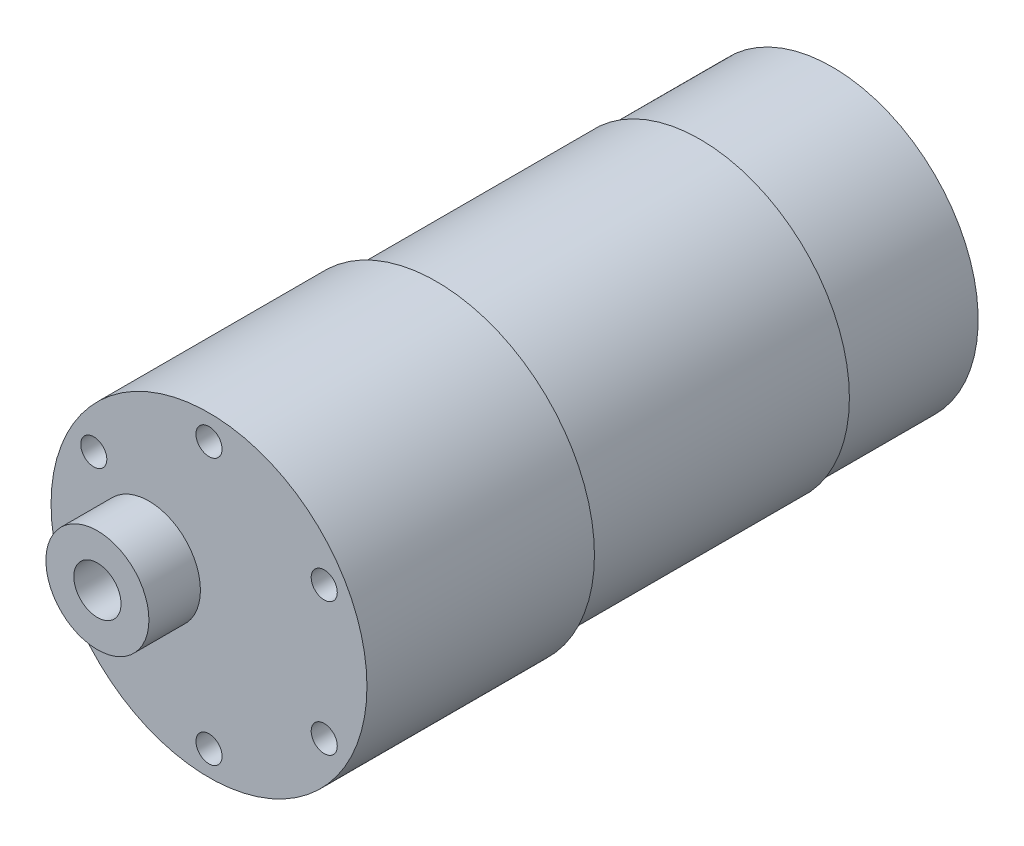
ISO-10303-21;
HEADER;
FILE_DESCRIPTION(('STEP AP214'),'2;1');
FILE_NAME('part.step','',(''),(''),'','','');
FILE_SCHEMA(('AUTOMOTIVE_DESIGN { 1 0 10303 214 1 1 1 1 }'));
ENDSEC;
DATA;
#1=APPLICATION_CONTEXT('core data for automotive mechanical design processes');
#2=APPLICATION_PROTOCOL_DEFINITION('international standard','automotive_design',2000,#1);
#3=PRODUCT_CONTEXT('',#1,'mechanical');
#4=PRODUCT('Part','Part','',(#3));
#5=PRODUCT_RELATED_PRODUCT_CATEGORY('part','',(#4));
#6=PRODUCT_DEFINITION_FORMATION('','',#4);
#7=PRODUCT_DEFINITION_CONTEXT('part definition',#1,'design');
#8=PRODUCT_DEFINITION('design','',#6,#7);
#9=PRODUCT_DEFINITION_SHAPE('','',#8);
#10=(LENGTH_UNIT() NAMED_UNIT(*) SI_UNIT(.MILLI.,.METRE.));
#11=(NAMED_UNIT(*) PLANE_ANGLE_UNIT() SI_UNIT($,.RADIAN.));
#12=(NAMED_UNIT(*) SI_UNIT($,.STERADIAN.) SOLID_ANGLE_UNIT());
#13=UNCERTAINTY_MEASURE_WITH_UNIT(LENGTH_MEASURE(1.E-05),#10,'distance_accuracy_value','');
#14=(GEOMETRIC_REPRESENTATION_CONTEXT(3) GLOBAL_UNCERTAINTY_ASSIGNED_CONTEXT((#13)) GLOBAL_UNIT_ASSIGNED_CONTEXT((#10,
#11,#12)) REPRESENTATION_CONTEXT('',''));
#15=CARTESIAN_POINT('',(0.,0.,0.));
#16=DIRECTION('',(0.,0.,1.));
#17=DIRECTION('',(1.,0.,0.));
#18=AXIS2_PLACEMENT_3D('',#15,#16,#17);
#19=CARTESIAN_POINT('',(7.,0.,-26.5));
#20=DIRECTION('',(0.,0.,-1.));
#21=DIRECTION('',(-1.,0.,0.));
#22=AXIS2_PLACEMENT_3D('',#19,#20,#21);
#23=CYLINDRICAL_SURFACE('',#22,17.4);
#24=CARTESIAN_POINT('',(7.,0.,-26.5));
#25=DIRECTION('',(0.,0.,1.));
#26=DIRECTION('',(1.,0.,0.));
#27=AXIS2_PLACEMENT_3D('',#24,#25,#26);
#28=CIRCLE('',#27,17.4);
#29=CARTESIAN_POINT('',(24.4,0.,-26.5));
#30=VERTEX_POINT('',#29);
#31=EDGE_CURVE('E42',#30,#30,#28,.T.);
#32=ORIENTED_EDGE('',*,*,#31,.F.);
#33=EDGE_LOOP('',(#32));
#34=FACE_BOUND('',#33,.T.);
#35=CARTESIAN_POINT('',(7.,0.,-57.2));
#36=DIRECTION('',(0.,0.,1.));
#37=DIRECTION('',(1.,0.,0.));
#38=AXIS2_PLACEMENT_3D('',#35,#36,#37);
#39=CIRCLE('',#38,17.4);
#40=CARTESIAN_POINT('',(24.4,0.,-57.2));
#41=VERTEX_POINT('',#40);
#42=EDGE_CURVE('E47',#41,#41,#39,.T.);
#43=ORIENTED_EDGE('',*,*,#42,.T.);
#44=EDGE_LOOP('',(#43));
#45=FACE_BOUND('',#44,.T.);
#46=ADVANCED_FACE('F40',(#34,#45),#23,.T.);
#47=CARTESIAN_POINT('',(7.,0.,-57.2));
#48=DIRECTION('',(0.,0.,1.));
#49=DIRECTION('',(1.,0.,0.));
#50=AXIS2_PLACEMENT_3D('',#47,#48,#49);
#51=PLANE('',#50);
#52=CARTESIAN_POINT('',(7.,0.,-57.2));
#53=DIRECTION('',(0.,0.,1.));
#54=DIRECTION('',(1.,0.,0.));
#55=AXIS2_PLACEMENT_3D('',#52,#53,#54);
#56=CIRCLE('',#55,17.);
#57=CARTESIAN_POINT('',(-10.,0.,-57.2));
#58=VERTEX_POINT('',#57);
#59=EDGE_CURVE('E277',#58,#58,#56,.T.);
#60=ORIENTED_EDGE('',*,*,#59,.T.);
#61=EDGE_LOOP('',(#60));
#62=FACE_BOUND('',#61,.T.);
#63=ORIENTED_EDGE('',*,*,#42,.F.);
#64=EDGE_LOOP('',(#63));
#65=FACE_BOUND('',#64,.T.);
#66=ADVANCED_FACE('F125',(#62,#65),#51,.F.);
#67=CARTESIAN_POINT('',(7.,0.,0.));
#68=DIRECTION('',(0.,0.,-1.));
#69=DIRECTION('',(-1.,0.,0.));
#70=AXIS2_PLACEMENT_3D('',#67,#68,#69);
#71=CYLINDRICAL_SURFACE('',#70,18.4);
#72=CARTESIAN_POINT('',(7.,0.,0.));
#73=DIRECTION('',(0.,0.,1.));
#74=DIRECTION('',(1.,0.,0.));
#75=AXIS2_PLACEMENT_3D('',#72,#73,#74);
#76=CIRCLE('',#75,18.4);
#77=CARTESIAN_POINT('',(25.4,0.,0.));
#78=VERTEX_POINT('',#77);
#79=EDGE_CURVE('E74',#78,#78,#76,.T.);
#80=ORIENTED_EDGE('',*,*,#79,.F.);
#81=EDGE_LOOP('',(#80));
#82=FACE_BOUND('',#81,.T.);
#83=CARTESIAN_POINT('',(7.,0.,-26.5));
#84=DIRECTION('',(0.,0.,1.));
#85=DIRECTION('',(1.,0.,0.));
#86=AXIS2_PLACEMENT_3D('',#83,#84,#85);
#87=CIRCLE('',#86,18.4);
#88=CARTESIAN_POINT('',(25.4,0.,-26.5));
#89=VERTEX_POINT('',#88);
#90=EDGE_CURVE('E80',#89,#89,#87,.T.);
#91=ORIENTED_EDGE('',*,*,#90,.T.);
#92=EDGE_LOOP('',(#91));
#93=FACE_BOUND('',#92,.T.);
#94=ADVANCED_FACE('F126',(#82,#93),#71,.T.);
#95=CARTESIAN_POINT('',(7.,0.,0.));
#96=DIRECTION('',(0.,0.,1.));
#97=DIRECTION('',(1.,0.,0.));
#98=AXIS2_PLACEMENT_3D('',#95,#96,#97);
#99=PLANE('',#98);
#100=CARTESIAN_POINT('',(0.,0.,0.));
#101=DIRECTION('',(0.,0.,1.));
#102=DIRECTION('',(1.,0.,0.));
#103=AXIS2_PLACEMENT_3D('',#100,#101,#102);
#104=CIRCLE('',#103,6.);
#105=CARTESIAN_POINT('',(6.,0.,0.));
#106=VERTEX_POINT('',#105);
#107=EDGE_CURVE('E10',#106,#106,#104,.T.);
#108=ORIENTED_EDGE('',*,*,#107,.F.);
#109=EDGE_LOOP('',(#108));
#110=FACE_BOUND('',#109,.T.);
#111=CARTESIAN_POINT('',(20.4233937586588,-7.75000000000001,0.));
#112=DIRECTION('',(0.,0.,1.));
#113=DIRECTION('',(1.,0.,0.));
#114=AXIS2_PLACEMENT_3D('',#111,#112,#113);
#115=CIRCLE('',#114,1.52);
#116=CARTESIAN_POINT('',(21.9433937586588,-7.75000000000001,0.));
#117=VERTEX_POINT('',#116);
#118=EDGE_CURVE('E79',#117,#117,#115,.F.);
#119=ORIENTED_EDGE('',*,*,#118,.T.);
#120=EDGE_LOOP('',(#119));
#121=FACE_BOUND('',#120,.T.);
#122=CARTESIAN_POINT('',(7.,-15.5,0.));
#123=DIRECTION('',(0.,0.,1.));
#124=DIRECTION('',(1.,0.,0.));
#125=AXIS2_PLACEMENT_3D('',#122,#123,#124);
#126=CIRCLE('',#125,1.52);
#127=CARTESIAN_POINT('',(8.52,-15.5,0.));
#128=VERTEX_POINT('',#127);
#129=EDGE_CURVE('E94',#128,#128,#126,.F.);
#130=ORIENTED_EDGE('',*,*,#129,.T.);
#131=EDGE_LOOP('',(#130));
#132=FACE_BOUND('',#131,.T.);
#133=CARTESIAN_POINT('',(-6.4233937586588,-7.75,0.));
#134=DIRECTION('',(0.,0.,1.));
#135=DIRECTION('',(1.,0.,0.));
#136=AXIS2_PLACEMENT_3D('',#133,#134,#135);
#137=CIRCLE('',#136,1.52);
#138=CARTESIAN_POINT('',(-4.9033937586588,-7.75,0.));
#139=VERTEX_POINT('',#138);
#140=EDGE_CURVE('E93',#139,#139,#137,.F.);
#141=ORIENTED_EDGE('',*,*,#140,.T.);
#142=EDGE_LOOP('',(#141));
#143=FACE_BOUND('',#142,.T.);
#144=CARTESIAN_POINT('',(-6.4233937586588,7.75,0.));
#145=DIRECTION('',(0.,0.,1.));
#146=DIRECTION('',(1.,0.,0.));
#147=AXIS2_PLACEMENT_3D('',#144,#145,#146);
#148=CIRCLE('',#147,1.52);
#149=CARTESIAN_POINT('',(-4.9033937586588,7.75,0.));
#150=VERTEX_POINT('',#149);
#151=EDGE_CURVE('E86',#150,#150,#148,.F.);
#152=ORIENTED_EDGE('',*,*,#151,.T.);
#153=EDGE_LOOP('',(#152));
#154=FACE_BOUND('',#153,.T.);
#155=CARTESIAN_POINT('',(7.,15.5,0.));
#156=DIRECTION('',(0.,0.,1.));
#157=DIRECTION('',(1.,0.,0.));
#158=AXIS2_PLACEMENT_3D('',#155,#156,#157);
#159=CIRCLE('',#158,1.52);
#160=CARTESIAN_POINT('',(8.52,15.5,0.));
#161=VERTEX_POINT('',#160);
#162=EDGE_CURVE('E84',#161,#161,#159,.F.);
#163=ORIENTED_EDGE('',*,*,#162,.T.);
#164=EDGE_LOOP('',(#163));
#165=FACE_BOUND('',#164,.T.);
#166=CARTESIAN_POINT('',(20.4233937586588,7.75,0.));
#167=DIRECTION('',(0.,0.,1.));
#168=DIRECTION('',(1.,0.,0.));
#169=AXIS2_PLACEMENT_3D('',#166,#167,#168);
#170=CIRCLE('',#169,1.52);
#171=CARTESIAN_POINT('',(21.9433937586588,7.75,0.));
#172=VERTEX_POINT('',#171);
#173=EDGE_CURVE('E71',#172,#172,#170,.F.);
#174=ORIENTED_EDGE('',*,*,#173,.T.);
#175=EDGE_LOOP('',(#174));
#176=FACE_BOUND('',#175,.T.);
#177=ORIENTED_EDGE('',*,*,#79,.T.);
#178=EDGE_LOOP('',(#177));
#179=FACE_BOUND('',#178,.T.);
#180=ADVANCED_FACE('F97',(#110,#121,#132,#143,#154,#165,#176,#179),#99,.T.);
#181=CARTESIAN_POINT('',(7.,0.,-26.5));
#182=DIRECTION('',(0.,0.,1.));
#183=DIRECTION('',(1.,0.,0.));
#184=AXIS2_PLACEMENT_3D('',#181,#182,#183);
#185=PLANE('',#184);
#186=ORIENTED_EDGE('',*,*,#31,.T.);
#187=EDGE_LOOP('',(#186));
#188=FACE_BOUND('',#187,.T.);
#189=ORIENTED_EDGE('',*,*,#90,.F.);
#190=EDGE_LOOP('',(#189));
#191=FACE_BOUND('',#190,.T.);
#192=ADVANCED_FACE('F131',(#188,#191),#185,.F.);
#193=CARTESIAN_POINT('',(20.4233937586588,7.75,0.2));
#194=DIRECTION('',(0.,0.,-1.));
#195=DIRECTION('',(-1.,0.,0.));
#196=AXIS2_PLACEMENT_3D('',#193,#194,#195);
#197=CYLINDRICAL_SURFACE('',#196,1.52);
#198=ORIENTED_EDGE('',*,*,#173,.F.);
#199=EDGE_LOOP('',(#198));
#200=FACE_BOUND('',#199,.T.);
#201=CARTESIAN_POINT('',(20.4233937586588,7.75,-3.));
#202=DIRECTION('',(0.,0.,1.));
#203=DIRECTION('',(1.,0.,0.));
#204=AXIS2_PLACEMENT_3D('',#201,#202,#203);
#205=CIRCLE('',#204,1.52);
#206=CARTESIAN_POINT('',(21.9433937586588,7.75,-3.));
#207=VERTEX_POINT('',#206);
#208=EDGE_CURVE('E59',#207,#207,#205,.T.);
#209=ORIENTED_EDGE('',*,*,#208,.F.);
#210=EDGE_LOOP('',(#209));
#211=FACE_BOUND('',#210,.T.);
#212=ADVANCED_FACE('F137',(#200,#211),#197,.F.);
#213=CARTESIAN_POINT('',(20.4233937586588,7.75,-3.));
#214=DIRECTION('',(0.,0.,1.));
#215=DIRECTION('',(1.,0.,0.));
#216=AXIS2_PLACEMENT_3D('',#213,#214,#215);
#217=PLANE('',#216);
#218=ORIENTED_EDGE('',*,*,#208,.T.);
#219=EDGE_LOOP('',(#218));
#220=FACE_BOUND('',#219,.T.);
#221=ADVANCED_FACE('F151',(#220),#217,.T.);
#222=CARTESIAN_POINT('',(7.,15.5,0.2));
#223=DIRECTION('',(0.,0.,-1.));
#224=DIRECTION('',(-1.,0.,0.));
#225=AXIS2_PLACEMENT_3D('',#222,#223,#224);
#226=CYLINDRICAL_SURFACE('',#225,1.52);
#227=ORIENTED_EDGE('',*,*,#162,.F.);
#228=EDGE_LOOP('',(#227));
#229=FACE_BOUND('',#228,.T.);
#230=CARTESIAN_POINT('',(7.,15.5,-3.));
#231=DIRECTION('',(0.,0.,1.));
#232=DIRECTION('',(1.,0.,0.));
#233=AXIS2_PLACEMENT_3D('',#230,#231,#232);
#234=CIRCLE('',#233,1.52);
#235=CARTESIAN_POINT('',(8.52,15.5,-3.));
#236=VERTEX_POINT('',#235);
#237=EDGE_CURVE('E54',#236,#236,#234,.T.);
#238=ORIENTED_EDGE('',*,*,#237,.F.);
#239=EDGE_LOOP('',(#238));
#240=FACE_BOUND('',#239,.T.);
#241=ADVANCED_FACE('F152',(#229,#240),#226,.F.);
#242=CARTESIAN_POINT('',(7.,15.5,-3.));
#243=DIRECTION('',(0.,0.,1.));
#244=DIRECTION('',(1.,0.,0.));
#245=AXIS2_PLACEMENT_3D('',#242,#243,#244);
#246=PLANE('',#245);
#247=ORIENTED_EDGE('',*,*,#237,.T.);
#248=EDGE_LOOP('',(#247));
#249=FACE_BOUND('',#248,.T.);
#250=ADVANCED_FACE('F157',(#249),#246,.T.);
#251=CARTESIAN_POINT('',(-6.4233937586588,7.75,0.2));
#252=DIRECTION('',(0.,0.,-1.));
#253=DIRECTION('',(-1.,0.,0.));
#254=AXIS2_PLACEMENT_3D('',#251,#252,#253);
#255=CYLINDRICAL_SURFACE('',#254,1.52);
#256=ORIENTED_EDGE('',*,*,#151,.F.);
#257=EDGE_LOOP('',(#256));
#258=FACE_BOUND('',#257,.T.);
#259=CARTESIAN_POINT('',(-6.4233937586588,7.75,-3.));
#260=DIRECTION('',(0.,0.,1.));
#261=DIRECTION('',(1.,0.,0.));
#262=AXIS2_PLACEMENT_3D('',#259,#260,#261);
#263=CIRCLE('',#262,1.52);
#264=CARTESIAN_POINT('',(-4.9033937586588,7.75,-3.));
#265=VERTEX_POINT('',#264);
#266=EDGE_CURVE('E56',#265,#265,#263,.T.);
#267=ORIENTED_EDGE('',*,*,#266,.F.);
#268=EDGE_LOOP('',(#267));
#269=FACE_BOUND('',#268,.T.);
#270=ADVANCED_FACE('F170',(#258,#269),#255,.F.);
#271=CARTESIAN_POINT('',(-6.4233937586588,7.75,-3.));
#272=DIRECTION('',(0.,0.,1.));
#273=DIRECTION('',(1.,0.,0.));
#274=AXIS2_PLACEMENT_3D('',#271,#272,#273);
#275=PLANE('',#274);
#276=ORIENTED_EDGE('',*,*,#266,.T.);
#277=EDGE_LOOP('',(#276));
#278=FACE_BOUND('',#277,.T.);
#279=ADVANCED_FACE('F176',(#278),#275,.T.);
#280=CARTESIAN_POINT('',(-6.4233937586588,-7.75,0.2));
#281=DIRECTION('',(0.,0.,-1.));
#282=DIRECTION('',(-1.,0.,0.));
#283=AXIS2_PLACEMENT_3D('',#280,#281,#282);
#284=CYLINDRICAL_SURFACE('',#283,1.52);
#285=ORIENTED_EDGE('',*,*,#140,.F.);
#286=EDGE_LOOP('',(#285));
#287=FACE_BOUND('',#286,.T.);
#288=CARTESIAN_POINT('',(-6.4233937586588,-7.75,-3.));
#289=DIRECTION('',(0.,0.,1.));
#290=DIRECTION('',(1.,0.,0.));
#291=AXIS2_PLACEMENT_3D('',#288,#289,#290);
#292=CIRCLE('',#291,1.52);
#293=CARTESIAN_POINT('',(-4.9033937586588,-7.75,-3.));
#294=VERTEX_POINT('',#293);
#295=EDGE_CURVE('E65',#294,#294,#292,.T.);
#296=ORIENTED_EDGE('',*,*,#295,.F.);
#297=EDGE_LOOP('',(#296));
#298=FACE_BOUND('',#297,.T.);
#299=ADVANCED_FACE('F179',(#287,#298),#284,.F.);
#300=CARTESIAN_POINT('',(-6.4233937586588,-7.75,-3.));
#301=DIRECTION('',(0.,0.,1.));
#302=DIRECTION('',(1.,0.,0.));
#303=AXIS2_PLACEMENT_3D('',#300,#301,#302);
#304=PLANE('',#303);
#305=ORIENTED_EDGE('',*,*,#295,.T.);
#306=EDGE_LOOP('',(#305));
#307=FACE_BOUND('',#306,.T.);
#308=ADVANCED_FACE('F184',(#307),#304,.T.);
#309=CARTESIAN_POINT('',(7.,-15.5,0.2));
#310=DIRECTION('',(0.,0.,-1.));
#311=DIRECTION('',(-1.,0.,0.));
#312=AXIS2_PLACEMENT_3D('',#309,#310,#311);
#313=CYLINDRICAL_SURFACE('',#312,1.52);
#314=ORIENTED_EDGE('',*,*,#129,.F.);
#315=EDGE_LOOP('',(#314));
#316=FACE_BOUND('',#315,.T.);
#317=CARTESIAN_POINT('',(7.,-15.5,-3.));
#318=DIRECTION('',(0.,0.,1.));
#319=DIRECTION('',(1.,0.,0.));
#320=AXIS2_PLACEMENT_3D('',#317,#318,#319);
#321=CIRCLE('',#320,1.52);
#322=CARTESIAN_POINT('',(8.52,-15.5,-3.));
#323=VERTEX_POINT('',#322);
#324=EDGE_CURVE('E61',#323,#323,#321,.T.);
#325=ORIENTED_EDGE('',*,*,#324,.F.);
#326=EDGE_LOOP('',(#325));
#327=FACE_BOUND('',#326,.T.);
#328=ADVANCED_FACE('F188',(#316,#327),#313,.F.);
#329=CARTESIAN_POINT('',(7.,-15.5,-3.));
#330=DIRECTION('',(0.,0.,1.));
#331=DIRECTION('',(1.,0.,0.));
#332=AXIS2_PLACEMENT_3D('',#329,#330,#331);
#333=PLANE('',#332);
#334=ORIENTED_EDGE('',*,*,#324,.T.);
#335=EDGE_LOOP('',(#334));
#336=FACE_BOUND('',#335,.T.);
#337=ADVANCED_FACE('F106',(#336),#333,.T.);
#338=CARTESIAN_POINT('',(20.4233937586588,-7.75000000000001,0.2));
#339=DIRECTION('',(0.,0.,-1.));
#340=DIRECTION('',(-1.,0.,0.));
#341=AXIS2_PLACEMENT_3D('',#338,#339,#340);
#342=CYLINDRICAL_SURFACE('',#341,1.52);
#343=ORIENTED_EDGE('',*,*,#118,.F.);
#344=EDGE_LOOP('',(#343));
#345=FACE_BOUND('',#344,.T.);
#346=CARTESIAN_POINT('',(20.4233937586588,-7.75000000000001,-3.));
#347=DIRECTION('',(0.,0.,1.));
#348=DIRECTION('',(1.,0.,0.));
#349=AXIS2_PLACEMENT_3D('',#346,#347,#348);
#350=CIRCLE('',#349,1.52);
#351=CARTESIAN_POINT('',(21.9433937586588,-7.75000000000001,-3.));
#352=VERTEX_POINT('',#351);
#353=EDGE_CURVE('E67',#352,#352,#350,.T.);
#354=ORIENTED_EDGE('',*,*,#353,.F.);
#355=EDGE_LOOP('',(#354));
#356=FACE_BOUND('',#355,.T.);
#357=ADVANCED_FACE('F105',(#345,#356),#342,.F.);
#358=CARTESIAN_POINT('',(20.4233937586588,-7.75000000000001,-3.));
#359=DIRECTION('',(0.,0.,1.));
#360=DIRECTION('',(1.,0.,0.));
#361=AXIS2_PLACEMENT_3D('',#358,#359,#360);
#362=PLANE('',#361);
#363=ORIENTED_EDGE('',*,*,#353,.T.);
#364=EDGE_LOOP('',(#363));
#365=FACE_BOUND('',#364,.T.);
#366=ADVANCED_FACE('F104',(#365),#362,.T.);
#367=CARTESIAN_POINT('',(0.,0.,6.));
#368=DIRECTION('',(0.,0.,-1.));
#369=DIRECTION('',(-1.,0.,0.));
#370=AXIS2_PLACEMENT_3D('',#367,#368,#369);
#371=CYLINDRICAL_SURFACE('',#370,6.);
#372=CARTESIAN_POINT('',(0.,0.,6.));
#373=DIRECTION('',(0.,0.,1.));
#374=DIRECTION('',(1.,0.,0.));
#375=AXIS2_PLACEMENT_3D('',#372,#373,#374);
#376=CIRCLE('',#375,6.);
#377=CARTESIAN_POINT('',(6.,0.,6.));
#378=VERTEX_POINT('',#377);
#379=EDGE_CURVE('E52',#378,#378,#376,.T.);
#380=ORIENTED_EDGE('',*,*,#379,.F.);
#381=EDGE_LOOP('',(#380));
#382=FACE_BOUND('',#381,.T.);
#383=ORIENTED_EDGE('',*,*,#107,.T.);
#384=EDGE_LOOP('',(#383));
#385=FACE_BOUND('',#384,.T.);
#386=ADVANCED_FACE('F112',(#382,#385),#371,.T.);
#387=CARTESIAN_POINT('',(0.,0.,6.));
#388=DIRECTION('',(0.,0.,1.));
#389=DIRECTION('',(1.,0.,0.));
#390=AXIS2_PLACEMENT_3D('',#387,#388,#389);
#391=PLANE('',#390);
#392=CARTESIAN_POINT('',(0.,0.,6.));
#393=DIRECTION('',(0.,0.,1.));
#394=DIRECTION('',(1.,0.,0.));
#395=AXIS2_PLACEMENT_3D('',#392,#393,#394);
#396=CIRCLE('',#395,2.75);
#397=CARTESIAN_POINT('',(2.75,0.,6.));
#398=VERTEX_POINT('',#397);
#399=EDGE_CURVE('E37',#398,#398,#396,.F.);
#400=ORIENTED_EDGE('',*,*,#399,.T.);
#401=EDGE_LOOP('',(#400));
#402=FACE_BOUND('',#401,.T.);
#403=ORIENTED_EDGE('',*,*,#379,.T.);
#404=EDGE_LOOP('',(#403));
#405=FACE_BOUND('',#404,.T.);
#406=ADVANCED_FACE('F120',(#402,#405),#391,.T.);
#407=CARTESIAN_POINT('',(7.,0.,-57.2));
#408=DIRECTION('',(0.,0.,-1.));
#409=DIRECTION('',(-1.,0.,0.));
#410=AXIS2_PLACEMENT_3D('',#407,#408,#409);
#411=CYLINDRICAL_SURFACE('',#410,17.);
#412=CARTESIAN_POINT('',(7.,0.,-72.6));
#413=DIRECTION('',(0.,0.,1.));
#414=DIRECTION('',(1.,0.,0.));
#415=AXIS2_PLACEMENT_3D('',#412,#413,#414);
#416=CIRCLE('',#415,17.);
#417=CARTESIAN_POINT('',(-10.,0.,-72.6));
#418=VERTEX_POINT('',#417);
#419=EDGE_CURVE('E273',#418,#418,#416,.T.);
#420=CARTESIAN_POINT('',(-10.,0.,-57.2));
#421=CARTESIAN_POINT('',(-10.,0.,-57.3604166666667));
#422=CARTESIAN_POINT('',(-10.,0.,-57.5208333333333));
#423=CARTESIAN_POINT('',(-10.,0.,-57.8416666666667));
#424=CARTESIAN_POINT('',(-10.,0.,-58.0020833333334));
#425=CARTESIAN_POINT('',(-10.,0.,-58.3229166666667));
#426=CARTESIAN_POINT('',(-10.,0.,-58.4833333333334));
#427=CARTESIAN_POINT('',(-10.,0.,-58.8041666666667));
#428=CARTESIAN_POINT('',(-10.,0.,-58.9645833333334));
#429=CARTESIAN_POINT('',(-10.,0.,-59.2854166666667));
#430=CARTESIAN_POINT('',(-10.,0.,-59.4458333333333));
#431=CARTESIAN_POINT('',(-10.,0.,-59.7666666666667));
#432=CARTESIAN_POINT('',(-10.,0.,-59.9270833333333));
#433=CARTESIAN_POINT('',(-10.,0.,-60.2479166666667));
#434=CARTESIAN_POINT('',(-10.,0.,-60.4083333333333));
#435=CARTESIAN_POINT('',(-10.,0.,-60.7291666666667));
#436=CARTESIAN_POINT('',(-10.,0.,-60.8895833333333));
#437=CARTESIAN_POINT('',(-10.,0.,-61.2104166666667));
#438=CARTESIAN_POINT('',(-10.,0.,-61.3708333333334));
#439=CARTESIAN_POINT('',(-10.,0.,-61.6916666666667));
#440=CARTESIAN_POINT('',(-10.,0.,-61.8520833333333));
#441=CARTESIAN_POINT('',(-10.,0.,-62.1729166666667));
#442=CARTESIAN_POINT('',(-10.,0.,-62.3333333333333));
#443=CARTESIAN_POINT('',(-10.,0.,-62.6541666666667));
#444=CARTESIAN_POINT('',(-10.,0.,-62.8145833333334));
#445=CARTESIAN_POINT('',(-10.,0.,-63.1354166666667));
#446=CARTESIAN_POINT('',(-10.,0.,-63.2958333333334));
#447=CARTESIAN_POINT('',(-10.,0.,-63.6166666666667));
#448=CARTESIAN_POINT('',(-10.,0.,-63.7770833333334));
#449=CARTESIAN_POINT('',(-10.,0.,-64.0979166666667));
#450=CARTESIAN_POINT('',(-10.,0.,-64.2583333333334));
#451=CARTESIAN_POINT('',(-10.,0.,-64.5791666666667));
#452=CARTESIAN_POINT('',(-10.,0.,-64.7395833333334));
#453=CARTESIAN_POINT('',(-10.,0.,-65.0604166666667));
#454=CARTESIAN_POINT('',(-10.,0.,-65.2208333333334));
#455=CARTESIAN_POINT('',(-10.,0.,-65.5416666666667));
#456=CARTESIAN_POINT('',(-10.,0.,-65.7020833333333));
#457=CARTESIAN_POINT('',(-10.,0.,-66.0229166666667));
#458=CARTESIAN_POINT('',(-10.,0.,-66.1833333333334));
#459=CARTESIAN_POINT('',(-10.,0.,-66.5041666666667));
#460=CARTESIAN_POINT('',(-10.,0.,-66.6645833333334));
#461=CARTESIAN_POINT('',(-10.,0.,-66.9854166666667));
#462=CARTESIAN_POINT('',(-10.,0.,-67.1458333333333));
#463=CARTESIAN_POINT('',(-10.,0.,-67.4666666666667));
#464=CARTESIAN_POINT('',(-10.,0.,-67.6270833333333));
#465=CARTESIAN_POINT('',(-10.,0.,-67.9479166666667));
#466=CARTESIAN_POINT('',(-10.,0.,-68.1083333333333));
#467=CARTESIAN_POINT('',(-10.,0.,-68.4291666666667));
#468=CARTESIAN_POINT('',(-10.,0.,-68.5895833333334));
#469=CARTESIAN_POINT('',(-10.,0.,-68.9104166666667));
#470=CARTESIAN_POINT('',(-10.,0.,-69.0708333333334));
#471=CARTESIAN_POINT('',(-10.,0.,-69.3916666666667));
#472=CARTESIAN_POINT('',(-10.,0.,-69.5520833333333));
#473=CARTESIAN_POINT('',(-10.,0.,-69.8729166666667));
#474=CARTESIAN_POINT('',(-10.,0.,-70.0333333333333));
#475=CARTESIAN_POINT('',(-10.,0.,-70.3541666666667));
#476=CARTESIAN_POINT('',(-10.,0.,-70.5145833333333));
#477=CARTESIAN_POINT('',(-10.,0.,-70.8354166666667));
#478=CARTESIAN_POINT('',(-10.,0.,-70.9958333333334));
#479=CARTESIAN_POINT('',(-10.,0.,-71.3166666666667));
#480=CARTESIAN_POINT('',(-10.,0.,-71.4770833333334));
#481=CARTESIAN_POINT('',(-10.,0.,-71.7979166666667));
#482=CARTESIAN_POINT('',(-10.,0.,-71.9583333333333));
#483=CARTESIAN_POINT('',(-10.,0.,-72.2791666666667));
#484=CARTESIAN_POINT('',(-10.,0.,-72.4395833333333));
#485=CARTESIAN_POINT('',(-10.,0.,-72.6));
#486=B_SPLINE_CURVE_WITH_KNOTS('',3,(#420,#421,#422,#423,#424,#425,#426,#427,#428,#429,#430,
#431,#432,#433,#434,#435,#436,#437,#438,#439,#440,#441,#442,#443,#444,#445,#446,#447,#448,#449,
#450,#451,#452,#453,#454,#455,#456,#457,#458,#459,#460,#461,#462,#463,#464,#465,#466,#467,#468,
#469,#470,#471,#472,#473,#474,#475,#476,#477,#478,#479,#480,#481,#482,#483,#484,#485),
.UNSPECIFIED.,.F.,.F.,(4,2,2,2,2,2,2,2,2,2,2,2,2,2,2,2,2,2,2,2,2,2,2,2,2,2,2,2,2,2,2,2,4),(0.,
0.481250000000003,0.962500000000005,1.44375,1.925,2.40625000000001,2.8875,3.36875,
3.85000000000001,4.33125,4.8125,5.29375,5.775,6.25625,6.73750000000001,7.21875000000001,7.7,
8.18125,8.6625,9.14375000000001,9.62500000000001,10.10625,10.5875,11.06875,11.55,12.03125,
12.5125,12.99375,13.475,13.95625,14.4375,14.91875,15.4),.UNSPECIFIED.);
#487=EDGE_CURVE('BSEAM227',#58,#418,#486,.T.);
#488=ORIENTED_EDGE('',*,*,#59,.F.);
#489=ORIENTED_EDGE('',*,*,#419,.T.);
#490=ORIENTED_EDGE('',*,*,#487,.T.);
#491=ORIENTED_EDGE('',*,*,#487,.F.);
#492=EDGE_LOOP('',(#488,#490,#489,#491));
#493=FACE_BOUND('',#492,.T.);
#494=ADVANCED_FACE('F227',(#493),#411,.T.);
#495=CARTESIAN_POINT('',(7.,0.,-72.6));
#496=DIRECTION('',(0.,0.,1.));
#497=DIRECTION('',(1.,0.,0.));
#498=AXIS2_PLACEMENT_3D('',#495,#496,#497);
#499=PLANE('',#498);
#500=ORIENTED_EDGE('',*,*,#419,.F.);
#501=EDGE_LOOP('',(#500));
#502=FACE_BOUND('',#501,.T.);
#503=ADVANCED_FACE('F240',(#502),#499,.F.);
#504=CARTESIAN_POINT('',(0.,0.,6.1));
#505=DIRECTION('',(0.,0.,-1.));
#506=DIRECTION('',(-1.,0.,0.));
#507=AXIS2_PLACEMENT_3D('',#504,#505,#506);
#508=CYLINDRICAL_SURFACE('',#507,2.75);
#509=ORIENTED_EDGE('',*,*,#399,.F.);
#510=EDGE_LOOP('',(#509));
#511=FACE_BOUND('',#510,.T.);
#512=CARTESIAN_POINT('',(0.,0.,1.6));
#513=DIRECTION('',(0.,0.,1.));
#514=DIRECTION('',(1.,0.,0.));
#515=AXIS2_PLACEMENT_3D('',#512,#513,#514);
#516=CIRCLE('',#515,2.75);
#517=CARTESIAN_POINT('',(2.75,0.,1.6));
#518=VERTEX_POINT('',#517);
#519=EDGE_CURVE('E269',#518,#518,#516,.T.);
#520=ORIENTED_EDGE('',*,*,#519,.F.);
#521=EDGE_LOOP('',(#520));
#522=FACE_BOUND('',#521,.T.);
#523=ADVANCED_FACE('F246',(#511,#522),#508,.F.);
#524=CARTESIAN_POINT('',(0.,0.,1.6));
#525=DIRECTION('',(0.,0.,1.));
#526=DIRECTION('',(1.,0.,0.));
#527=AXIS2_PLACEMENT_3D('',#524,#525,#526);
#528=PLANE('',#527);
#529=ORIENTED_EDGE('',*,*,#519,.T.);
#530=EDGE_LOOP('',(#529));
#531=FACE_BOUND('',#530,.T.);
#532=ADVANCED_FACE('F254',(#531),#528,.T.);
#533=CLOSED_SHELL('',(#46,#66,#94,#180,#192,#212,#221,#241,#250,#270,#279,#299,#308,#328,#337,
#357,#366,#386,#406,#494,#503,#523,#532));
#534=MANIFOLD_SOLID_BREP('B2',#533);
#535=ADVANCED_BREP_SHAPE_REPRESENTATION('',(#18,#534),#14);
#536=SHAPE_DEFINITION_REPRESENTATION(#9,#535);
ENDSEC;
END-ISO-10303-21;
